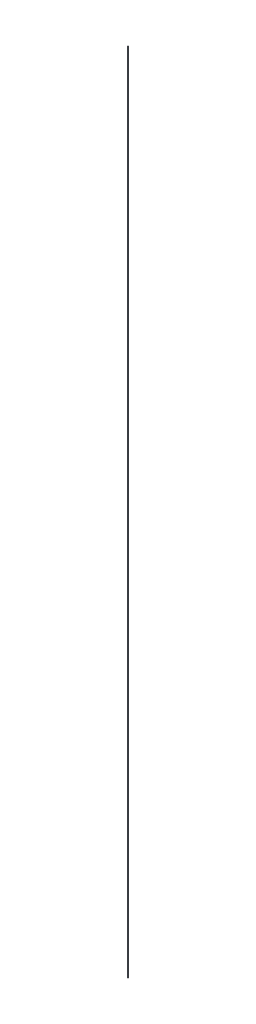
ISO-10303-21;
HEADER;
FILE_DESCRIPTION(('STEP AP214'),'2;1');
FILE_NAME('part.step','',(''),(''),'','','');
FILE_SCHEMA(('AUTOMOTIVE_DESIGN { 1 0 10303 214 1 1 1 1 }'));
ENDSEC;
DATA;
#1=APPLICATION_CONTEXT('core data for automotive mechanical design processes');
#2=APPLICATION_PROTOCOL_DEFINITION('international standard','automotive_design',2000,#1);
#3=PRODUCT_CONTEXT('',#1,'mechanical');
#4=PRODUCT('Part','Part','',(#3));
#5=PRODUCT_RELATED_PRODUCT_CATEGORY('part','',(#4));
#6=PRODUCT_DEFINITION_FORMATION('','',#4);
#7=PRODUCT_DEFINITION_CONTEXT('part definition',#1,'design');
#8=PRODUCT_DEFINITION('design','',#6,#7);
#9=PRODUCT_DEFINITION_SHAPE('','',#8);
#10=(LENGTH_UNIT() NAMED_UNIT(*) SI_UNIT(.MILLI.,.METRE.));
#11=(NAMED_UNIT(*) PLANE_ANGLE_UNIT() SI_UNIT($,.RADIAN.));
#12=(NAMED_UNIT(*) SI_UNIT($,.STERADIAN.) SOLID_ANGLE_UNIT());
#13=UNCERTAINTY_MEASURE_WITH_UNIT(LENGTH_MEASURE(1.E-05),#10,'distance_accuracy_value','');
#14=(GEOMETRIC_REPRESENTATION_CONTEXT(3) GLOBAL_UNCERTAINTY_ASSIGNED_CONTEXT((#13)) GLOBAL_UNIT_ASSIGNED_CONTEXT((#10,
#11,#12)) REPRESENTATION_CONTEXT('',''));
#15=CARTESIAN_POINT('',(0.,0.,0.));
#16=DIRECTION('',(0.,0.,1.));
#17=DIRECTION('',(1.,0.,0.));
#18=AXIS2_PLACEMENT_3D('',#15,#16,#17);
#19=CARTESIAN_POINT('',(0.,3000.,0.));
#20=DIRECTION('',(0.,-1.,0.));
#21=DIRECTION('',(0.,0.,-1.));
#22=AXIS2_PLACEMENT_3D('',#19,#20,#21);
#23=CYLINDRICAL_SURFACE('',#22,1.5);
#24=CARTESIAN_POINT('',(0.,3000.,0.));
#25=DIRECTION('',(0.,1.,0.));
#26=DIRECTION('',(0.,0.,1.));
#27=AXIS2_PLACEMENT_3D('',#24,#25,#26);
#28=CIRCLE('',#27,1.5);
#29=CARTESIAN_POINT('',(0.,3000.,1.5));
#30=VERTEX_POINT('',#29);
#31=EDGE_CURVE('E10',#30,#30,#28,.T.);
#32=ORIENTED_EDGE('',*,*,#31,.F.);
#33=EDGE_LOOP('',(#32));
#34=FACE_BOUND('',#33,.T.);
#35=CARTESIAN_POINT('',(0.,0.,0.));
#36=DIRECTION('',(0.,1.,0.));
#37=DIRECTION('',(0.,0.,1.));
#38=AXIS2_PLACEMENT_3D('',#35,#36,#37);
#39=CIRCLE('',#38,1.5);
#40=CARTESIAN_POINT('',(0.,0.,1.5));
#41=VERTEX_POINT('',#40);
#42=EDGE_CURVE('E38',#41,#41,#39,.T.);
#43=ORIENTED_EDGE('',*,*,#42,.T.);
#44=EDGE_LOOP('',(#43));
#45=FACE_BOUND('',#44,.T.);
#46=ADVANCED_FACE('F35',(#34,#45),#23,.T.);
#47=CARTESIAN_POINT('',(0.,3000.,0.));
#48=DIRECTION('',(0.,1.,0.));
#49=DIRECTION('',(0.,0.,1.));
#50=AXIS2_PLACEMENT_3D('',#47,#48,#49);
#51=PLANE('',#50);
#52=ORIENTED_EDGE('',*,*,#31,.T.);
#53=EDGE_LOOP('',(#52));
#54=FACE_BOUND('',#53,.T.);
#55=ADVANCED_FACE('F50',(#54),#51,.T.);
#56=CARTESIAN_POINT('',(0.,0.,0.));
#57=DIRECTION('',(0.,1.,0.));
#58=DIRECTION('',(0.,0.,1.));
#59=AXIS2_PLACEMENT_3D('',#56,#57,#58);
#60=PLANE('',#59);
#61=ORIENTED_EDGE('',*,*,#42,.F.);
#62=EDGE_LOOP('',(#61));
#63=FACE_BOUND('',#62,.T.);
#64=ADVANCED_FACE('F48',(#63),#60,.F.);
#65=CLOSED_SHELL('',(#46,#55,#64));
#66=MANIFOLD_SOLID_BREP('B2',#65);
#67=ADVANCED_BREP_SHAPE_REPRESENTATION('',(#18,#66),#14);
#68=SHAPE_DEFINITION_REPRESENTATION(#9,#67);
ENDSEC;
END-ISO-10303-21;
